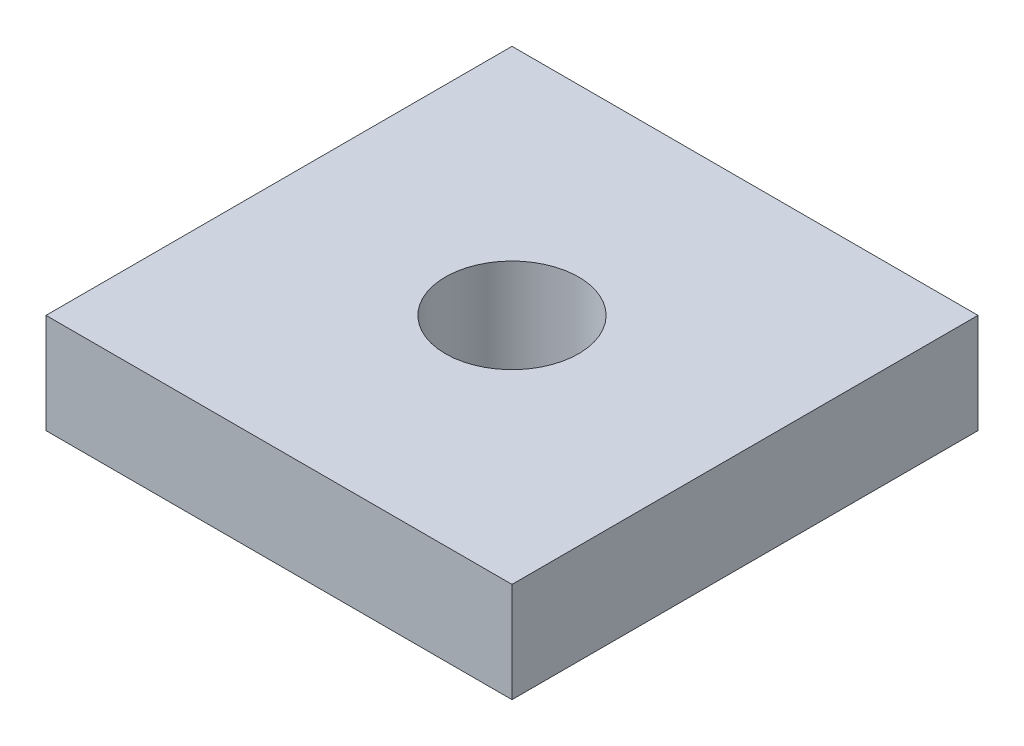
ISO-10303-21;
HEADER;
FILE_DESCRIPTION(('STEP AP214'),'2;1');
FILE_NAME('part.step','',(''),(''),'','','');
FILE_SCHEMA(('AUTOMOTIVE_DESIGN { 1 0 10303 214 1 1 1 1 }'));
ENDSEC;
DATA;
#1=APPLICATION_CONTEXT('core data for automotive mechanical design processes');
#2=APPLICATION_PROTOCOL_DEFINITION('international standard','automotive_design',2000,#1);
#3=PRODUCT_CONTEXT('',#1,'mechanical');
#4=PRODUCT('Part','Part','',(#3));
#5=PRODUCT_RELATED_PRODUCT_CATEGORY('part','',(#4));
#6=PRODUCT_DEFINITION_FORMATION('','',#4);
#7=PRODUCT_DEFINITION_CONTEXT('part definition',#1,'design');
#8=PRODUCT_DEFINITION('design','',#6,#7);
#9=PRODUCT_DEFINITION_SHAPE('','',#8);
#10=(LENGTH_UNIT() NAMED_UNIT(*) SI_UNIT(.MILLI.,.METRE.));
#11=(NAMED_UNIT(*) PLANE_ANGLE_UNIT() SI_UNIT($,.RADIAN.));
#12=(NAMED_UNIT(*) SI_UNIT($,.STERADIAN.) SOLID_ANGLE_UNIT());
#13=UNCERTAINTY_MEASURE_WITH_UNIT(LENGTH_MEASURE(1.E-05),#10,'distance_accuracy_value','');
#14=(GEOMETRIC_REPRESENTATION_CONTEXT(3) GLOBAL_UNCERTAINTY_ASSIGNED_CONTEXT((#13)) GLOBAL_UNIT_ASSIGNED_CONTEXT((#10,
#11,#12)) REPRESENTATION_CONTEXT('',''));
#15=CARTESIAN_POINT('',(0.,0.,0.));
#16=DIRECTION('',(0.,0.,1.));
#17=DIRECTION('',(1.,0.,0.));
#18=AXIS2_PLACEMENT_3D('',#15,#16,#17);
#19=CARTESIAN_POINT('',(0.,9.525,0.));
#20=DIRECTION('',(1.,0.,0.));
#21=DIRECTION('',(0.,0.,-1.));
#22=AXIS2_PLACEMENT_3D('',#19,#20,#21);
#23=PLANE('',#22);
#24=DIRECTION('',(0.,0.,1.));
#25=VECTOR('',#24,1.);
#26=CARTESIAN_POINT('',(0.,0.,0.));
#27=LINE('',#26,#25);
#28=CARTESIAN_POINT('',(0.,0.,0.));
#29=VERTEX_POINT('',#28);
#30=CARTESIAN_POINT('',(0.,0.,44.45));
#31=VERTEX_POINT('',#30);
#32=EDGE_CURVE('E93',#29,#31,#27,.T.);
#33=ORIENTED_EDGE('',*,*,#32,.T.);
#34=DIRECTION('',(0.,-1.,0.));
#35=VECTOR('',#34,1.);
#36=CARTESIAN_POINT('',(0.,9.525,44.45));
#37=LINE('',#36,#35);
#38=CARTESIAN_POINT('',(0.,9.525,44.45));
#39=VERTEX_POINT('',#38);
#40=EDGE_CURVE('E11',#39,#31,#37,.T.);
#41=ORIENTED_EDGE('',*,*,#40,.F.);
#42=DIRECTION('',(0.,0.,1.));
#43=VECTOR('',#42,1.);
#44=CARTESIAN_POINT('',(0.,9.525,0.));
#45=LINE('',#44,#43);
#46=CARTESIAN_POINT('',(0.,9.525,0.));
#47=VERTEX_POINT('',#46);
#48=EDGE_CURVE('E81',#47,#39,#45,.T.);
#49=ORIENTED_EDGE('',*,*,#48,.F.);
#50=DIRECTION('',(0.,-1.,0.));
#51=VECTOR('',#50,1.);
#52=CARTESIAN_POINT('',(0.,9.525,0.));
#53=LINE('',#52,#51);
#54=EDGE_CURVE('E89',#47,#29,#53,.T.);
#55=ORIENTED_EDGE('',*,*,#54,.T.);
#56=EDGE_LOOP('',(#33,#41,#49,#55));
#57=FACE_BOUND('',#56,.T.);
#58=ADVANCED_FACE('F30',(#57),#23,.F.);
#59=CARTESIAN_POINT('',(0.,9.525,44.45));
#60=DIRECTION('',(0.,0.,-1.));
#61=DIRECTION('',(-1.,0.,0.));
#62=AXIS2_PLACEMENT_3D('',#59,#60,#61);
#63=PLANE('',#62);
#64=DIRECTION('',(1.,0.,0.));
#65=VECTOR('',#64,1.);
#66=CARTESIAN_POINT('',(0.,0.,44.45));
#67=LINE('',#66,#65);
#68=CARTESIAN_POINT('',(44.45,0.,44.45));
#69=VERTEX_POINT('',#68);
#70=EDGE_CURVE('E85',#31,#69,#67,.T.);
#71=ORIENTED_EDGE('',*,*,#70,.T.);
#72=DIRECTION('',(0.,-1.,0.));
#73=VECTOR('',#72,1.);
#74=CARTESIAN_POINT('',(44.45,9.525,44.45));
#75=LINE('',#74,#73);
#76=CARTESIAN_POINT('',(44.45,9.525,44.45));
#77=VERTEX_POINT('',#76);
#78=EDGE_CURVE('E38',#77,#69,#75,.T.);
#79=ORIENTED_EDGE('',*,*,#78,.F.);
#80=DIRECTION('',(1.,0.,0.));
#81=VECTOR('',#80,1.);
#82=CARTESIAN_POINT('',(0.,9.525,44.45));
#83=LINE('',#82,#81);
#84=EDGE_CURVE('E76',#39,#77,#83,.T.);
#85=ORIENTED_EDGE('',*,*,#84,.F.);
#86=ORIENTED_EDGE('',*,*,#40,.T.);
#87=EDGE_LOOP('',(#71,#79,#85,#86));
#88=FACE_BOUND('',#87,.T.);
#89=ADVANCED_FACE('F84',(#88),#63,.F.);
#90=CARTESIAN_POINT('',(44.45,9.525,0.));
#91=DIRECTION('',(-1.,0.,0.));
#92=DIRECTION('',(0.,0.,1.));
#93=AXIS2_PLACEMENT_3D('',#90,#91,#92);
#94=PLANE('',#93);
#95=DIRECTION('',(0.,0.,-1.));
#96=VECTOR('',#95,1.);
#97=CARTESIAN_POINT('',(44.45,0.,0.));
#98=LINE('',#97,#96);
#99=CARTESIAN_POINT('',(44.45,0.,0.));
#100=VERTEX_POINT('',#99);
#101=EDGE_CURVE('E63',#69,#100,#98,.T.);
#102=ORIENTED_EDGE('',*,*,#101,.T.);
#103=DIRECTION('',(0.,-1.,0.));
#104=VECTOR('',#103,1.);
#105=CARTESIAN_POINT('',(44.45,9.525,0.));
#106=LINE('',#105,#104);
#107=CARTESIAN_POINT('',(44.45,9.525,0.));
#108=VERTEX_POINT('',#107);
#109=EDGE_CURVE('E86',#108,#100,#106,.T.);
#110=ORIENTED_EDGE('',*,*,#109,.F.);
#111=DIRECTION('',(0.,0.,-1.));
#112=VECTOR('',#111,1.);
#113=CARTESIAN_POINT('',(44.45,9.525,0.));
#114=LINE('',#113,#112);
#115=EDGE_CURVE('E79',#77,#108,#114,.T.);
#116=ORIENTED_EDGE('',*,*,#115,.F.);
#117=ORIENTED_EDGE('',*,*,#78,.T.);
#118=EDGE_LOOP('',(#102,#110,#116,#117));
#119=FACE_BOUND('',#118,.T.);
#120=ADVANCED_FACE('F87',(#119),#94,.F.);
#121=CARTESIAN_POINT('',(0.,9.525,0.));
#122=DIRECTION('',(0.,0.,1.));
#123=DIRECTION('',(1.,0.,0.));
#124=AXIS2_PLACEMENT_3D('',#121,#122,#123);
#125=PLANE('',#124);
#126=DIRECTION('',(-1.,0.,0.));
#127=VECTOR('',#126,1.);
#128=CARTESIAN_POINT('',(0.,0.,0.));
#129=LINE('',#128,#127);
#130=EDGE_CURVE('E69',#100,#29,#129,.T.);
#131=ORIENTED_EDGE('',*,*,#130,.T.);
#132=ORIENTED_EDGE('',*,*,#54,.F.);
#133=DIRECTION('',(-1.,0.,0.));
#134=VECTOR('',#133,1.);
#135=CARTESIAN_POINT('',(0.,9.525,0.));
#136=LINE('',#135,#134);
#137=EDGE_CURVE('E46',#108,#47,#136,.T.);
#138=ORIENTED_EDGE('',*,*,#137,.F.);
#139=ORIENTED_EDGE('',*,*,#109,.T.);
#140=EDGE_LOOP('',(#131,#132,#138,#139));
#141=FACE_BOUND('',#140,.T.);
#142=ADVANCED_FACE('F101',(#141),#125,.F.);
#143=CARTESIAN_POINT('',(0.,9.525,44.45));
#144=DIRECTION('',(0.,1.,0.));
#145=DIRECTION('',(0.,0.,1.));
#146=AXIS2_PLACEMENT_3D('',#143,#144,#145);
#147=PLANE('',#146);
#148=CARTESIAN_POINT('',(22.225,9.525,22.225));
#149=DIRECTION('',(0.,1.,0.));
#150=DIRECTION('',(0.,0.,1.));
#151=AXIS2_PLACEMENT_3D('',#148,#149,#150);
#152=CIRCLE('',#151,6.35);
#153=CARTESIAN_POINT('',(22.225,9.525,28.575));
#154=VERTEX_POINT('',#153);
#155=EDGE_CURVE('E107',#154,#154,#152,.T.);
#156=ORIENTED_EDGE('',*,*,#155,.F.);
#157=EDGE_LOOP('',(#156));
#158=FACE_BOUND('',#157,.T.);
#159=ORIENTED_EDGE('',*,*,#48,.T.);
#160=ORIENTED_EDGE('',*,*,#84,.T.);
#161=ORIENTED_EDGE('',*,*,#115,.T.);
#162=ORIENTED_EDGE('',*,*,#137,.T.);
#163=EDGE_LOOP('',(#159,#160,#161,#162));
#164=FACE_BOUND('',#163,.T.);
#165=ADVANCED_FACE('F77',(#158,#164),#147,.T.);
#166=CARTESIAN_POINT('',(0.,0.,44.45));
#167=DIRECTION('',(0.,1.,0.));
#168=DIRECTION('',(0.,0.,1.));
#169=AXIS2_PLACEMENT_3D('',#166,#167,#168);
#170=PLANE('',#169);
#171=CARTESIAN_POINT('',(22.225,0.,22.225));
#172=DIRECTION('',(0.,1.,0.));
#173=DIRECTION('',(0.,0.,1.));
#174=AXIS2_PLACEMENT_3D('',#171,#172,#173);
#175=CIRCLE('',#174,6.35);
#176=CARTESIAN_POINT('',(22.225,0.,28.575));
#177=VERTEX_POINT('',#176);
#178=EDGE_CURVE('E96',#177,#177,#175,.T.);
#179=ORIENTED_EDGE('',*,*,#178,.T.);
#180=EDGE_LOOP('',(#179));
#181=FACE_BOUND('',#180,.T.);
#182=ORIENTED_EDGE('',*,*,#32,.F.);
#183=ORIENTED_EDGE('',*,*,#130,.F.);
#184=ORIENTED_EDGE('',*,*,#101,.F.);
#185=ORIENTED_EDGE('',*,*,#70,.F.);
#186=EDGE_LOOP('',(#182,#183,#184,#185));
#187=FACE_BOUND('',#186,.T.);
#188=ADVANCED_FACE('F104',(#181,#187),#170,.F.);
#189=CARTESIAN_POINT('',(22.225,0.,22.225));
#190=DIRECTION('',(0.,1.,0.));
#191=DIRECTION('',(0.,0.,1.));
#192=AXIS2_PLACEMENT_3D('',#189,#190,#191);
#193=CYLINDRICAL_SURFACE('',#192,6.35);
#194=CARTESIAN_POINT('',(22.225,0.,28.575));
#195=CARTESIAN_POINT('',(22.225,0.0992187499999999,28.575));
#196=CARTESIAN_POINT('',(22.225,0.1984375,28.575));
#197=CARTESIAN_POINT('',(22.225,0.396875,28.575));
#198=CARTESIAN_POINT('',(22.225,0.49609375,28.575));
#199=CARTESIAN_POINT('',(22.225,0.69453125,28.575));
#200=CARTESIAN_POINT('',(22.225,0.79375,28.575));
#201=CARTESIAN_POINT('',(22.225,0.9921875,28.575));
#202=CARTESIAN_POINT('',(22.225,1.09140625,28.575));
#203=CARTESIAN_POINT('',(22.225,1.28984375,28.575));
#204=CARTESIAN_POINT('',(22.225,1.3890625,28.575));
#205=CARTESIAN_POINT('',(22.225,1.5875,28.575));
#206=CARTESIAN_POINT('',(22.225,1.68671875,28.575));
#207=CARTESIAN_POINT('',(22.225,1.88515625,28.575));
#208=CARTESIAN_POINT('',(22.225,1.984375,28.575));
#209=CARTESIAN_POINT('',(22.225,2.1828125,28.575));
#210=CARTESIAN_POINT('',(22.225,2.28203125,28.575));
#211=CARTESIAN_POINT('',(22.225,2.48046875,28.575));
#212=CARTESIAN_POINT('',(22.225,2.5796875,28.575));
#213=CARTESIAN_POINT('',(22.225,2.778125,28.575));
#214=CARTESIAN_POINT('',(22.225,2.87734375,28.575));
#215=CARTESIAN_POINT('',(22.225,3.07578125,28.575));
#216=CARTESIAN_POINT('',(22.225,3.175,28.575));
#217=CARTESIAN_POINT('',(22.225,3.3734375,28.575));
#218=CARTESIAN_POINT('',(22.225,3.47265625,28.575));
#219=CARTESIAN_POINT('',(22.225,3.67109375,28.575));
#220=CARTESIAN_POINT('',(22.225,3.7703125,28.575));
#221=CARTESIAN_POINT('',(22.225,3.96875,28.575));
#222=CARTESIAN_POINT('',(22.225,4.06796875,28.575));
#223=CARTESIAN_POINT('',(22.225,4.26640625,28.575));
#224=CARTESIAN_POINT('',(22.225,4.365625,28.575));
#225=CARTESIAN_POINT('',(22.225,4.5640625,28.575));
#226=CARTESIAN_POINT('',(22.225,4.66328125,28.575));
#227=CARTESIAN_POINT('',(22.225,4.86171875,28.575));
#228=CARTESIAN_POINT('',(22.225,4.9609375,28.575));
#229=CARTESIAN_POINT('',(22.225,5.159375,28.575));
#230=CARTESIAN_POINT('',(22.225,5.25859375,28.575));
#231=CARTESIAN_POINT('',(22.225,5.45703125,28.575));
#232=CARTESIAN_POINT('',(22.225,5.55625,28.575));
#233=CARTESIAN_POINT('',(22.225,5.7546875,28.575));
#234=CARTESIAN_POINT('',(22.225,5.85390625,28.575));
#235=CARTESIAN_POINT('',(22.225,6.05234375,28.575));
#236=CARTESIAN_POINT('',(22.225,6.1515625,28.575));
#237=CARTESIAN_POINT('',(22.225,6.35,28.575));
#238=CARTESIAN_POINT('',(22.225,6.44921875,28.575));
#239=CARTESIAN_POINT('',(22.225,6.64765625,28.575));
#240=CARTESIAN_POINT('',(22.225,6.746875,28.575));
#241=CARTESIAN_POINT('',(22.225,6.9453125,28.575));
#242=CARTESIAN_POINT('',(22.225,7.04453125,28.575));
#243=CARTESIAN_POINT('',(22.225,7.24296875,28.575));
#244=CARTESIAN_POINT('',(22.225,7.3421875,28.575));
#245=CARTESIAN_POINT('',(22.225,7.540625,28.575));
#246=CARTESIAN_POINT('',(22.225,7.63984375,28.575));
#247=CARTESIAN_POINT('',(22.225,7.83828125,28.575));
#248=CARTESIAN_POINT('',(22.225,7.9375,28.575));
#249=CARTESIAN_POINT('',(22.225,8.1359375,28.575));
#250=CARTESIAN_POINT('',(22.225,8.23515625,28.575));
#251=CARTESIAN_POINT('',(22.225,8.43359375,28.575));
#252=CARTESIAN_POINT('',(22.225,8.5328125,28.575));
#253=CARTESIAN_POINT('',(22.225,8.73125,28.575));
#254=CARTESIAN_POINT('',(22.225,8.83046875,28.575));
#255=CARTESIAN_POINT('',(22.225,9.02890625,28.575));
#256=CARTESIAN_POINT('',(22.225,9.128125,28.575));
#257=CARTESIAN_POINT('',(22.225,9.3265625,28.575));
#258=CARTESIAN_POINT('',(22.225,9.42578125,28.575));
#259=CARTESIAN_POINT('',(22.225,9.525,28.575));
#260=B_SPLINE_CURVE_WITH_KNOTS('',3,(#194,#195,#196,#197,#198,#199,#200,#201,#202,#203,#204,
#205,#206,#207,#208,#209,#210,#211,#212,#213,#214,#215,#216,#217,#218,#219,#220,#221,#222,#223,
#224,#225,#226,#227,#228,#229,#230,#231,#232,#233,#234,#235,#236,#237,#238,#239,#240,#241,#242,
#243,#244,#245,#246,#247,#248,#249,#250,#251,#252,#253,#254,#255,#256,#257,#258,#259),
.UNSPECIFIED.,.F.,.F.,(4,2,2,2,2,2,2,2,2,2,2,2,2,2,2,2,2,2,2,2,2,2,2,2,2,2,2,2,2,2,2,2,4),(0.,
0.29765625,0.5953125,0.89296875,1.190625,1.48828125,1.7859375,2.08359375,2.38125,2.67890625,
2.9765625,3.27421875,3.571875,3.86953125,4.1671875,4.46484375,4.7625,5.06015625,5.3578125,
5.65546875,5.953125,6.25078125,6.5484375,6.84609375,7.14375,7.44140625,7.7390625,8.03671875,
8.334375,8.63203125,8.9296875,9.22734375,9.525),.UNSPECIFIED.);
#261=EDGE_CURVE('BSEAM114',#177,#154,#260,.T.);
#262=ORIENTED_EDGE('',*,*,#178,.F.);
#263=ORIENTED_EDGE('',*,*,#155,.T.);
#264=ORIENTED_EDGE('',*,*,#261,.T.);
#265=ORIENTED_EDGE('',*,*,#261,.F.);
#266=EDGE_LOOP('',(#262,#264,#263,#265));
#267=FACE_BOUND('',#266,.T.);
#268=ADVANCED_FACE('F114',(#267),#193,.F.);
#269=CLOSED_SHELL('',(#58,#89,#120,#142,#165,#188,#268));
#270=MANIFOLD_SOLID_BREP('B2',#269);
#271=ADVANCED_BREP_SHAPE_REPRESENTATION('',(#18,#270),#14);
#272=SHAPE_DEFINITION_REPRESENTATION(#9,#271);
ENDSEC;
END-ISO-10303-21;
